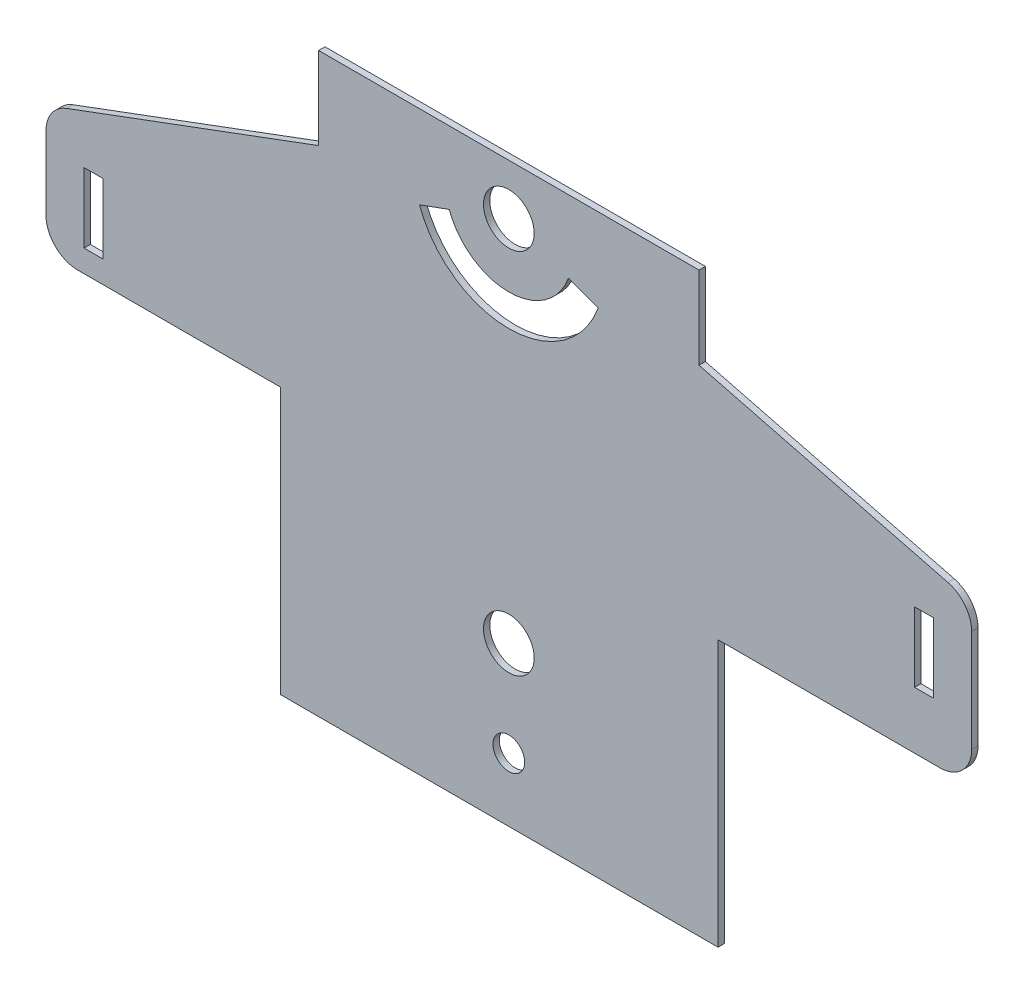
ISO-10303-21;
HEADER;
FILE_DESCRIPTION(('STEP AP214'),'2;1');
FILE_NAME('part.step','',(''),(''),'','','');
FILE_SCHEMA(('AUTOMOTIVE_DESIGN { 1 0 10303 214 1 1 1 1 }'));
ENDSEC;
DATA;
#1=APPLICATION_CONTEXT('core data for automotive mechanical design processes');
#2=APPLICATION_PROTOCOL_DEFINITION('international standard','automotive_design',2000,#1);
#3=PRODUCT_CONTEXT('',#1,'mechanical');
#4=PRODUCT('Part','Part','',(#3));
#5=PRODUCT_RELATED_PRODUCT_CATEGORY('part','',(#4));
#6=PRODUCT_DEFINITION_FORMATION('','',#4);
#7=PRODUCT_DEFINITION_CONTEXT('part definition',#1,'design');
#8=PRODUCT_DEFINITION('design','',#6,#7);
#9=PRODUCT_DEFINITION_SHAPE('','',#8);
#10=(LENGTH_UNIT() NAMED_UNIT(*) SI_UNIT(.MILLI.,.METRE.));
#11=(NAMED_UNIT(*) PLANE_ANGLE_UNIT() SI_UNIT($,.RADIAN.));
#12=(NAMED_UNIT(*) SI_UNIT($,.STERADIAN.) SOLID_ANGLE_UNIT());
#13=UNCERTAINTY_MEASURE_WITH_UNIT(LENGTH_MEASURE(1.E-05),#10,'distance_accuracy_value','');
#14=(GEOMETRIC_REPRESENTATION_CONTEXT(3) GLOBAL_UNCERTAINTY_ASSIGNED_CONTEXT((#13)) GLOBAL_UNIT_ASSIGNED_CONTEXT((#10,
#11,#12)) REPRESENTATION_CONTEXT('',''));
#15=CARTESIAN_POINT('',(0.,0.,0.));
#16=DIRECTION('',(0.,0.,1.));
#17=DIRECTION('',(1.,0.,0.));
#18=AXIS2_PLACEMENT_3D('',#15,#16,#17);
#19=CARTESIAN_POINT('',(0.,45.5,1.));
#20=DIRECTION('',(0.,-1.,0.));
#21=DIRECTION('',(1.,0.,0.));
#22=AXIS2_PLACEMENT_3D('',#19,#20,#21);
#23=PLANE('',#22);
#24=DIRECTION('',(0.,0.,1.));
#25=VECTOR('',#24,1.);
#26=CARTESIAN_POINT('',(-29.,45.5,1.));
#27=LINE('',#26,#25);
#28=CARTESIAN_POINT('',(-29.,45.5,0.));
#29=VERTEX_POINT('',#28);
#30=CARTESIAN_POINT('',(-29.,45.5,1.));
#31=VERTEX_POINT('',#30);
#32=EDGE_CURVE('E11',#29,#31,#27,.T.);
#33=ORIENTED_EDGE('',*,*,#32,.F.);
#34=DIRECTION('',(1.,0.,0.));
#35=VECTOR('',#34,1.);
#36=CARTESIAN_POINT('',(0.,45.5,0.));
#37=LINE('',#36,#35);
#38=CARTESIAN_POINT('',(-32.,45.5,0.));
#39=VERTEX_POINT('',#38);
#40=EDGE_CURVE('E165',#39,#29,#37,.T.);
#41=ORIENTED_EDGE('',*,*,#40,.F.);
#42=DIRECTION('',(0.,0.,1.));
#43=VECTOR('',#42,1.);
#44=CARTESIAN_POINT('',(-32.,45.5,1.));
#45=LINE('',#44,#43);
#46=CARTESIAN_POINT('',(-32.,45.5,1.));
#47=VERTEX_POINT('',#46);
#48=EDGE_CURVE('E48',#39,#47,#45,.T.);
#49=ORIENTED_EDGE('',*,*,#48,.T.);
#50=DIRECTION('',(1.,0.,0.));
#51=VECTOR('',#50,1.);
#52=CARTESIAN_POINT('',(0.,45.5,1.));
#53=LINE('',#52,#51);
#54=EDGE_CURVE('E255',#47,#31,#53,.T.);
#55=ORIENTED_EDGE('',*,*,#54,.T.);
#56=EDGE_LOOP('',(#33,#41,#49,#55));
#57=FACE_BOUND('',#56,.T.);
#58=ADVANCED_FACE('F38',(#57),#23,.F.);
#59=CARTESIAN_POINT('',(-32.,0.,1.));
#60=DIRECTION('',(-1.,0.,0.));
#61=DIRECTION('',(0.,-1.,0.));
#62=AXIS2_PLACEMENT_3D('',#59,#60,#61);
#63=PLANE('',#62);
#64=ORIENTED_EDGE('',*,*,#48,.F.);
#65=DIRECTION('',(0.,1.,0.));
#66=VECTOR('',#65,1.);
#67=CARTESIAN_POINT('',(-32.,0.,0.));
#68=LINE('',#67,#66);
#69=CARTESIAN_POINT('',(-32.,56.5,0.));
#70=VERTEX_POINT('',#69);
#71=EDGE_CURVE('E177',#70,#39,#68,.F.);
#72=ORIENTED_EDGE('',*,*,#71,.F.);
#73=DIRECTION('',(0.,0.,1.));
#74=VECTOR('',#73,1.);
#75=CARTESIAN_POINT('',(-32.,56.5,1.));
#76=LINE('',#75,#74);
#77=CARTESIAN_POINT('',(-32.,56.5,1.));
#78=VERTEX_POINT('',#77);
#79=EDGE_CURVE('E56',#70,#78,#76,.T.);
#80=ORIENTED_EDGE('',*,*,#79,.T.);
#81=DIRECTION('',(0.,-1.,0.));
#82=VECTOR('',#81,1.);
#83=CARTESIAN_POINT('',(-32.,0.,1.));
#84=LINE('',#83,#82);
#85=EDGE_CURVE('E230',#78,#47,#84,.T.);
#86=ORIENTED_EDGE('',*,*,#85,.T.);
#87=EDGE_LOOP('',(#64,#72,#80,#86));
#88=FACE_BOUND('',#87,.T.);
#89=ADVANCED_FACE('F260',(#88),#63,.F.);
#90=CARTESIAN_POINT('',(0.,56.5,1.));
#91=DIRECTION('',(0.,-1.,0.));
#92=DIRECTION('',(1.,0.,0.));
#93=AXIS2_PLACEMENT_3D('',#90,#91,#92);
#94=PLANE('',#93);
#95=ORIENTED_EDGE('',*,*,#79,.F.);
#96=DIRECTION('',(1.,0.,0.));
#97=VECTOR('',#96,1.);
#98=CARTESIAN_POINT('',(0.,56.5,0.));
#99=LINE('',#98,#97);
#100=CARTESIAN_POINT('',(-29.,56.5,0.));
#101=VERTEX_POINT('',#100);
#102=EDGE_CURVE('E164',#70,#101,#99,.T.);
#103=ORIENTED_EDGE('',*,*,#102,.T.);
#104=DIRECTION('',(0.,0.,1.));
#105=VECTOR('',#104,1.);
#106=CARTESIAN_POINT('',(-29.,56.5,1.));
#107=LINE('',#106,#105);
#108=CARTESIAN_POINT('',(-29.,56.5,1.));
#109=VERTEX_POINT('',#108);
#110=EDGE_CURVE('E42',#101,#109,#107,.T.);
#111=ORIENTED_EDGE('',*,*,#110,.T.);
#112=DIRECTION('',(1.,0.,0.));
#113=VECTOR('',#112,1.);
#114=CARTESIAN_POINT('',(0.,56.5,1.));
#115=LINE('',#114,#113);
#116=EDGE_CURVE('E491',#78,#109,#115,.T.);
#117=ORIENTED_EDGE('',*,*,#116,.F.);
#118=EDGE_LOOP('',(#95,#103,#111,#117));
#119=FACE_BOUND('',#118,.T.);
#120=ADVANCED_FACE('F167',(#119),#94,.T.);
#121=CARTESIAN_POINT('',(0.,62.,1.));
#122=DIRECTION('',(0.,1.,0.));
#123=DIRECTION('',(-1.,0.,0.));
#124=AXIS2_PLACEMENT_3D('',#121,#122,#123);
#125=PLANE('',#124);
#126=DIRECTION('',(0.,0.,1.));
#127=VECTOR('',#126,1.);
#128=CARTESIAN_POINT('',(99.,62.,1.));
#129=LINE('',#128,#127);
#130=CARTESIAN_POINT('',(99.,62.,0.));
#131=VERTEX_POINT('',#130);
#132=CARTESIAN_POINT('',(99.,62.,1.));
#133=VERTEX_POINT('',#132);
#134=EDGE_CURVE('E159',#131,#133,#129,.T.);
#135=ORIENTED_EDGE('',*,*,#134,.F.);
#136=DIRECTION('',(1.,0.,0.));
#137=VECTOR('',#136,1.);
#138=CARTESIAN_POINT('',(0.,62.,0.));
#139=LINE('',#138,#137);
#140=CARTESIAN_POINT('',(102.,62.,0.));
#141=VERTEX_POINT('',#140);
#142=EDGE_CURVE('E171',#141,#131,#139,.F.);
#143=ORIENTED_EDGE('',*,*,#142,.F.);
#144=DIRECTION('',(0.,0.,1.));
#145=VECTOR('',#144,1.);
#146=CARTESIAN_POINT('',(102.,62.,1.));
#147=LINE('',#146,#145);
#148=CARTESIAN_POINT('',(102.,62.,1.));
#149=VERTEX_POINT('',#148);
#150=EDGE_CURVE('E246',#141,#149,#147,.T.);
#151=ORIENTED_EDGE('',*,*,#150,.T.);
#152=DIRECTION('',(-1.,0.,0.));
#153=VECTOR('',#152,1.);
#154=CARTESIAN_POINT('',(0.,62.,1.));
#155=LINE('',#154,#153);
#156=EDGE_CURVE('E487',#149,#133,#155,.T.);
#157=ORIENTED_EDGE('',*,*,#156,.T.);
#158=EDGE_LOOP('',(#135,#143,#151,#157));
#159=FACE_BOUND('',#158,.T.);
#160=ADVANCED_FACE('F494',(#159),#125,.F.);
#161=CARTESIAN_POINT('',(102.,0.,1.));
#162=DIRECTION('',(1.,0.,0.));
#163=DIRECTION('',(0.,1.,0.));
#164=AXIS2_PLACEMENT_3D('',#161,#162,#163);
#165=PLANE('',#164);
#166=ORIENTED_EDGE('',*,*,#150,.F.);
#167=DIRECTION('',(0.,1.,0.));
#168=VECTOR('',#167,1.);
#169=CARTESIAN_POINT('',(102.,0.,0.));
#170=LINE('',#169,#168);
#171=CARTESIAN_POINT('',(102.,51.,0.));
#172=VERTEX_POINT('',#171);
#173=EDGE_CURVE('E168',#172,#141,#170,.T.);
#174=ORIENTED_EDGE('',*,*,#173,.F.);
#175=DIRECTION('',(0.,0.,1.));
#176=VECTOR('',#175,1.);
#177=CARTESIAN_POINT('',(102.,51.,1.));
#178=LINE('',#177,#176);
#179=CARTESIAN_POINT('',(102.,51.,1.));
#180=VERTEX_POINT('',#179);
#181=EDGE_CURVE('E243',#172,#180,#178,.T.);
#182=ORIENTED_EDGE('',*,*,#181,.T.);
#183=DIRECTION('',(0.,1.,0.));
#184=VECTOR('',#183,1.);
#185=CARTESIAN_POINT('',(102.,0.,1.));
#186=LINE('',#185,#184);
#187=EDGE_CURVE('E359',#180,#149,#186,.T.);
#188=ORIENTED_EDGE('',*,*,#187,.T.);
#189=EDGE_LOOP('',(#166,#174,#182,#188));
#190=FACE_BOUND('',#189,.T.);
#191=ADVANCED_FACE('F357',(#190),#165,.F.);
#192=CARTESIAN_POINT('',(0.,51.,1.));
#193=DIRECTION('',(0.,1.,0.));
#194=DIRECTION('',(-1.,0.,0.));
#195=AXIS2_PLACEMENT_3D('',#192,#193,#194);
#196=PLANE('',#195);
#197=ORIENTED_EDGE('',*,*,#181,.F.);
#198=DIRECTION('',(1.,0.,0.));
#199=VECTOR('',#198,1.);
#200=CARTESIAN_POINT('',(0.,51.,0.));
#201=LINE('',#200,#199);
#202=CARTESIAN_POINT('',(99.,51.,0.));
#203=VERTEX_POINT('',#202);
#204=EDGE_CURVE('E328',#172,#203,#201,.F.);
#205=ORIENTED_EDGE('',*,*,#204,.T.);
#206=DIRECTION('',(0.,0.,1.));
#207=VECTOR('',#206,1.);
#208=CARTESIAN_POINT('',(99.,51.,1.));
#209=LINE('',#208,#207);
#210=CARTESIAN_POINT('',(99.,51.,1.));
#211=VERTEX_POINT('',#210);
#212=EDGE_CURVE('E240',#203,#211,#209,.T.);
#213=ORIENTED_EDGE('',*,*,#212,.T.);
#214=DIRECTION('',(-1.,0.,0.));
#215=VECTOR('',#214,1.);
#216=CARTESIAN_POINT('',(0.,51.,1.));
#217=LINE('',#216,#215);
#218=EDGE_CURVE('E353',#180,#211,#217,.T.);
#219=ORIENTED_EDGE('',*,*,#218,.F.);
#220=EDGE_LOOP('',(#197,#205,#213,#219));
#221=FACE_BOUND('',#220,.T.);
#222=ADVANCED_FACE('F348',(#221),#196,.T.);
#223=CARTESIAN_POINT('',(30.7699080474094,84.539627558952,1.));
#224=DIRECTION('',(-0.34202014332567,-0.939692620785908,0.));
#225=DIRECTION('',(0.939692620785908,-0.34202014332567,0.));
#226=AXIS2_PLACEMENT_3D('',#223,#224,#225);
#227=PLANE('',#226);
#228=DIRECTION('',(0.,0.,1.));
#229=VECTOR('',#228,1.);
#230=CARTESIAN_POINT('',(44.3969262078591,79.5797985667433,1.));
#231=LINE('',#230,#229);
#232=CARTESIAN_POINT('',(44.3969262078591,79.5797985667433,0.));
#233=VERTEX_POINT('',#232);
#234=CARTESIAN_POINT('',(44.3969262078591,79.5797985667433,1.));
#235=VERTEX_POINT('',#234);
#236=EDGE_CURVE('E237',#233,#235,#231,.T.);
#237=ORIENTED_EDGE('',*,*,#236,.F.);
#238=DIRECTION('',(0.939692620785908,-0.34202014332567,0.));
#239=VECTOR('',#238,1.);
#240=CARTESIAN_POINT('',(30.7699080474094,84.539627558952,0.));
#241=LINE('',#240,#239);
#242=CARTESIAN_POINT('',(49.0953893117886,77.8696978501149,0.));
#243=VERTEX_POINT('',#242);
#244=EDGE_CURVE('E329',#233,#243,#241,.T.);
#245=ORIENTED_EDGE('',*,*,#244,.T.);
#246=DIRECTION('',(0.,0.,1.));
#247=VECTOR('',#246,1.);
#248=CARTESIAN_POINT('',(49.0953893117886,77.8696978501149,1.));
#249=LINE('',#248,#247);
#250=CARTESIAN_POINT('',(49.0953893117886,77.8696978501149,1.));
#251=VERTEX_POINT('',#250);
#252=EDGE_CURVE('E234',#243,#251,#249,.T.);
#253=ORIENTED_EDGE('',*,*,#252,.T.);
#254=DIRECTION('',(0.939692620785908,-0.34202014332567,0.));
#255=VECTOR('',#254,1.);
#256=CARTESIAN_POINT('',(30.7699080474094,84.539627558952,1.));
#257=LINE('',#256,#255);
#258=EDGE_CURVE('E478',#235,#251,#257,.T.);
#259=ORIENTED_EDGE('',*,*,#258,.F.);
#260=EDGE_LOOP('',(#237,#245,#253,#259));
#261=FACE_BOUND('',#260,.T.);
#262=ADVANCED_FACE('F521',(#261),#227,.T.);
#263=CARTESIAN_POINT('',(35.,83.,1.));
#264=DIRECTION('',(0.,0.,1.));
#265=DIRECTION('',(1.,0.,0.));
#266=AXIS2_PLACEMENT_3D('',#263,#264,#265);
#267=CYLINDRICAL_SURFACE('',#266,15.);
#268=ORIENTED_EDGE('',*,*,#252,.F.);
#269=CARTESIAN_POINT('',(35.,83.,0.));
#270=DIRECTION('',(0.,0.,1.));
#271=DIRECTION('',(1.,0.,0.));
#272=AXIS2_PLACEMENT_3D('',#269,#270,#271);
#273=CIRCLE('',#272,15.);
#274=CARTESIAN_POINT('',(20.9046106882113,77.869697850115,0.));
#275=VERTEX_POINT('',#274);
#276=EDGE_CURVE('E325',#275,#243,#273,.T.);
#277=ORIENTED_EDGE('',*,*,#276,.F.);
#278=DIRECTION('',(0.,0.,1.));
#279=VECTOR('',#278,1.);
#280=CARTESIAN_POINT('',(20.9046106882113,77.869697850115,1.));
#281=LINE('',#280,#279);
#282=CARTESIAN_POINT('',(20.9046106882113,77.869697850115,1.));
#283=VERTEX_POINT('',#282);
#284=EDGE_CURVE('E231',#275,#283,#281,.T.);
#285=ORIENTED_EDGE('',*,*,#284,.T.);
#286=CARTESIAN_POINT('',(35.,83.,1.));
#287=DIRECTION('',(0.,0.,1.));
#288=DIRECTION('',(1.,0.,0.));
#289=AXIS2_PLACEMENT_3D('',#286,#287,#288);
#290=CIRCLE('',#289,15.);
#291=EDGE_CURVE('E481',#283,#251,#290,.T.);
#292=ORIENTED_EDGE('',*,*,#291,.T.);
#293=EDGE_LOOP('',(#268,#277,#285,#292));
#294=FACE_BOUND('',#293,.T.);
#295=ADVANCED_FACE('F528',(#294),#267,.F.);
#296=CARTESIAN_POINT('',(-22.5814635565732,62.0420612199236,1.));
#297=DIRECTION('',(-0.342020143325663,0.939692620785911,0.));
#298=DIRECTION('',(-0.939692620785911,-0.342020143325663,0.));
#299=AXIS2_PLACEMENT_3D('',#296,#297,#298);
#300=PLANE('',#299);
#301=ORIENTED_EDGE('',*,*,#284,.F.);
#302=DIRECTION('',(-0.939692620785911,-0.342020143325663,0.));
#303=VECTOR('',#302,1.);
#304=CARTESIAN_POINT('',(-22.5814635565732,62.0420612199236,0.));
#305=LINE('',#304,#303);
#306=CARTESIAN_POINT('',(25.6030737921409,79.5797985667434,0.));
#307=VERTEX_POINT('',#306);
#308=EDGE_CURVE('E321',#307,#275,#305,.T.);
#309=ORIENTED_EDGE('',*,*,#308,.F.);
#310=DIRECTION('',(0.,0.,1.));
#311=VECTOR('',#310,1.);
#312=CARTESIAN_POINT('',(25.6030737921409,79.5797985667434,1.));
#313=LINE('',#312,#311);
#314=CARTESIAN_POINT('',(25.6030737921409,79.5797985667434,1.));
#315=VERTEX_POINT('',#314);
#316=EDGE_CURVE('E227',#307,#315,#313,.T.);
#317=ORIENTED_EDGE('',*,*,#316,.T.);
#318=DIRECTION('',(-0.939692620785911,-0.342020143325663,0.));
#319=VECTOR('',#318,1.);
#320=CARTESIAN_POINT('',(-22.5814635565732,62.0420612199236,1.));
#321=LINE('',#320,#319);
#322=EDGE_CURVE('E472',#315,#283,#321,.T.);
#323=ORIENTED_EDGE('',*,*,#322,.T.);
#324=EDGE_LOOP('',(#301,#309,#317,#323));
#325=FACE_BOUND('',#324,.T.);
#326=ADVANCED_FACE('F532',(#325),#300,.F.);
#327=CARTESIAN_POINT('',(22.7203045685279,88.8157360406091,1.));
#328=DIRECTION('',(0.247833249982633,0.968802704477566,0.));
#329=DIRECTION('',(-0.968802704477566,0.247833249982633,0.));
#330=AXIS2_PLACEMENT_3D('',#327,#328,#329);
#331=PLANE('',#330);
#332=DIRECTION('',(0.,0.,1.));
#333=VECTOR('',#332,1.);
#334=CARTESIAN_POINT('',(104.239166249913,67.9620737500222,1.));
#335=LINE('',#334,#333);
#336=CARTESIAN_POINT('',(104.239166249913,67.9620737500222,0.));
#337=VERTEX_POINT('',#336);
#338=CARTESIAN_POINT('',(104.239166249913,67.9620737500222,1.));
#339=VERTEX_POINT('',#338);
#340=EDGE_CURVE('E224',#337,#339,#335,.T.);
#341=ORIENTED_EDGE('',*,*,#340,.F.);
#342=DIRECTION('',(-0.968802704477566,0.247833249982633,0.));
#343=VECTOR('',#342,1.);
#344=CARTESIAN_POINT('',(22.7203045685279,88.8157360406091,0.));
#345=LINE('',#344,#343);
#346=CARTESIAN_POINT('',(65.,78.,0.));
#347=VERTEX_POINT('',#346);
#348=EDGE_CURVE('E308',#337,#347,#345,.T.);
#349=ORIENTED_EDGE('',*,*,#348,.T.);
#350=DIRECTION('',(0.,0.,1.));
#351=VECTOR('',#350,1.);
#352=CARTESIAN_POINT('',(65.,78.,1.));
#353=LINE('',#352,#351);
#354=CARTESIAN_POINT('',(65.,78.,1.));
#355=VERTEX_POINT('',#354);
#356=EDGE_CURVE('E221',#347,#355,#353,.T.);
#357=ORIENTED_EDGE('',*,*,#356,.T.);
#358=DIRECTION('',(-0.968802704477566,0.247833249982633,0.));
#359=VECTOR('',#358,1.);
#360=CARTESIAN_POINT('',(22.7203045685279,88.8157360406091,1.));
#361=LINE('',#360,#359);
#362=EDGE_CURVE('E424',#339,#355,#361,.T.);
#363=ORIENTED_EDGE('',*,*,#362,.F.);
#364=EDGE_LOOP('',(#341,#349,#357,#363));
#365=FACE_BOUND('',#364,.T.);
#366=ADVANCED_FACE('F536',(#365),#331,.T.);
#367=CARTESIAN_POINT('',(65.,0.,1.));
#368=DIRECTION('',(1.,0.,0.));
#369=DIRECTION('',(0.,1.,0.));
#370=AXIS2_PLACEMENT_3D('',#367,#368,#369);
#371=PLANE('',#370);
#372=ORIENTED_EDGE('',*,*,#356,.F.);
#373=DIRECTION('',(0.,1.,0.));
#374=VECTOR('',#373,1.);
#375=CARTESIAN_POINT('',(65.,0.,0.));
#376=LINE('',#375,#374);
#377=CARTESIAN_POINT('',(65.,91.,0.));
#378=VERTEX_POINT('',#377);
#379=EDGE_CURVE('E305',#347,#378,#376,.T.);
#380=ORIENTED_EDGE('',*,*,#379,.T.);
#381=DIRECTION('',(0.,0.,1.));
#382=VECTOR('',#381,1.);
#383=CARTESIAN_POINT('',(65.,91.,1.));
#384=LINE('',#383,#382);
#385=CARTESIAN_POINT('',(65.,91.,1.));
#386=VERTEX_POINT('',#385);
#387=EDGE_CURVE('E218',#378,#386,#384,.T.);
#388=ORIENTED_EDGE('',*,*,#387,.T.);
#389=DIRECTION('',(0.,1.,0.));
#390=VECTOR('',#389,1.);
#391=CARTESIAN_POINT('',(65.,0.,1.));
#392=LINE('',#391,#390);
#393=EDGE_CURVE('E426',#355,#386,#392,.T.);
#394=ORIENTED_EDGE('',*,*,#393,.F.);
#395=EDGE_LOOP('',(#372,#380,#388,#394));
#396=FACE_BOUND('',#395,.T.);
#397=ADVANCED_FACE('F553',(#396),#371,.T.);
#398=CARTESIAN_POINT('',(0.,91.,1.));
#399=DIRECTION('',(0.,1.,0.));
#400=DIRECTION('',(-1.,0.,0.));
#401=AXIS2_PLACEMENT_3D('',#398,#399,#400);
#402=PLANE('',#401);
#403=ORIENTED_EDGE('',*,*,#387,.F.);
#404=DIRECTION('',(1.,0.,0.));
#405=VECTOR('',#404,1.);
#406=CARTESIAN_POINT('',(0.,91.,0.));
#407=LINE('',#406,#405);
#408=CARTESIAN_POINT('',(5.,91.,0.));
#409=VERTEX_POINT('',#408);
#410=EDGE_CURVE('E302',#378,#409,#407,.F.);
#411=ORIENTED_EDGE('',*,*,#410,.T.);
#412=DIRECTION('',(0.,0.,1.));
#413=VECTOR('',#412,1.);
#414=CARTESIAN_POINT('',(5.,91.,1.));
#415=LINE('',#414,#413);
#416=CARTESIAN_POINT('',(5.,91.,1.));
#417=VERTEX_POINT('',#416);
#418=EDGE_CURVE('E215',#409,#417,#415,.T.);
#419=ORIENTED_EDGE('',*,*,#418,.T.);
#420=DIRECTION('',(-1.,0.,0.));
#421=VECTOR('',#420,1.);
#422=CARTESIAN_POINT('',(0.,91.,1.));
#423=LINE('',#422,#421);
#424=EDGE_CURVE('E431',#386,#417,#423,.T.);
#425=ORIENTED_EDGE('',*,*,#424,.F.);
#426=EDGE_LOOP('',(#403,#411,#419,#425));
#427=FACE_BOUND('',#426,.T.);
#428=ADVANCED_FACE('F557',(#427),#402,.T.);
#429=CARTESIAN_POINT('',(5.00000000000001,0.,1.));
#430=DIRECTION('',(-1.,0.,0.));
#431=DIRECTION('',(0.,-1.,0.));
#432=AXIS2_PLACEMENT_3D('',#429,#430,#431);
#433=PLANE('',#432);
#434=ORIENTED_EDGE('',*,*,#418,.F.);
#435=DIRECTION('',(0.,1.,0.));
#436=VECTOR('',#435,1.);
#437=CARTESIAN_POINT('',(5.,0.,0.));
#438=LINE('',#437,#436);
#439=CARTESIAN_POINT('',(5.00000000000001,78.,0.));
#440=VERTEX_POINT('',#439);
#441=EDGE_CURVE('E299',#409,#440,#438,.F.);
#442=ORIENTED_EDGE('',*,*,#441,.T.);
#443=DIRECTION('',(0.,0.,1.));
#444=VECTOR('',#443,1.);
#445=CARTESIAN_POINT('',(5.00000000000001,78.,1.));
#446=LINE('',#445,#444);
#447=CARTESIAN_POINT('',(5.00000000000001,78.,1.));
#448=VERTEX_POINT('',#447);
#449=EDGE_CURVE('E212',#440,#448,#446,.T.);
#450=ORIENTED_EDGE('',*,*,#449,.T.);
#451=DIRECTION('',(0.,-1.,0.));
#452=VECTOR('',#451,1.);
#453=CARTESIAN_POINT('',(5.00000000000001,0.,1.));
#454=LINE('',#453,#452);
#455=EDGE_CURVE('E434',#417,#448,#454,.T.);
#456=ORIENTED_EDGE('',*,*,#455,.F.);
#457=EDGE_LOOP('',(#434,#442,#450,#456));
#458=FACE_BOUND('',#457,.T.);
#459=ADVANCED_FACE('F561',(#458),#433,.T.);
#460=CARTESIAN_POINT('',(-24.8855106888361,66.879809976247,1.));
#461=DIRECTION('',(-0.348733712021418,0.937221851057562,0.));
#462=DIRECTION('',(-0.937221851057562,-0.348733712021418,0.));
#463=AXIS2_PLACEMENT_3D('',#460,#461,#462);
#464=PLANE('',#463);
#465=ORIENTED_EDGE('',*,*,#449,.F.);
#466=DIRECTION('',(-0.937221851057562,-0.348733712021418,0.));
#467=VECTOR('',#466,1.);
#468=CARTESIAN_POINT('',(-24.8855106888361,66.879809976247,0.));
#469=LINE('',#468,#467);
#470=CARTESIAN_POINT('',(-34.7436685601071,63.2116582101927,0.));
#471=VERTEX_POINT('',#470);
#472=EDGE_CURVE('E296',#440,#471,#469,.T.);
#473=ORIENTED_EDGE('',*,*,#472,.T.);
#474=DIRECTION('',(0.,0.,1.));
#475=VECTOR('',#474,1.);
#476=CARTESIAN_POINT('',(-34.7436685601071,63.2116582101927,1.));
#477=LINE('',#476,#475);
#478=CARTESIAN_POINT('',(-34.7436685601071,63.2116582101927,1.));
#479=VERTEX_POINT('',#478);
#480=EDGE_CURVE('E209',#471,#479,#477,.T.);
#481=ORIENTED_EDGE('',*,*,#480,.T.);
#482=DIRECTION('',(-0.937221851057562,-0.348733712021418,0.));
#483=VECTOR('',#482,1.);
#484=CARTESIAN_POINT('',(-24.8855106888361,66.879809976247,1.));
#485=LINE('',#484,#483);
#486=EDGE_CURVE('E437',#448,#479,#485,.T.);
#487=ORIENTED_EDGE('',*,*,#486,.F.);
#488=EDGE_LOOP('',(#465,#473,#481,#487));
#489=FACE_BOUND('',#488,.T.);
#490=ADVANCED_FACE('F565',(#489),#464,.T.);
#491=CARTESIAN_POINT('',(-33.,58.5255489549049,1.));
#492=DIRECTION('',(0.,0.,1.));
#493=DIRECTION('',(1.,0.,0.));
#494=AXIS2_PLACEMENT_3D('',#491,#492,#493);
#495=CYLINDRICAL_SURFACE('',#494,5.);
#496=ORIENTED_EDGE('',*,*,#480,.F.);
#497=CARTESIAN_POINT('',(-33.,58.5255489549049,0.));
#498=DIRECTION('',(0.,0.,1.));
#499=DIRECTION('',(1.,0.,0.));
#500=AXIS2_PLACEMENT_3D('',#497,#498,#499);
#501=CIRCLE('',#500,5.);
#502=CARTESIAN_POINT('',(-38.,58.5255489549049,0.));
#503=VERTEX_POINT('',#502);
#504=EDGE_CURVE('E293',#471,#503,#501,.T.);
#505=ORIENTED_EDGE('',*,*,#504,.T.);
#506=DIRECTION('',(0.,0.,1.));
#507=VECTOR('',#506,1.);
#508=CARTESIAN_POINT('',(-38.,58.5255489549049,1.));
#509=LINE('',#508,#507);
#510=CARTESIAN_POINT('',(-38.,58.5255489549049,1.));
#511=VERTEX_POINT('',#510);
#512=EDGE_CURVE('E206',#503,#511,#509,.T.);
#513=ORIENTED_EDGE('',*,*,#512,.T.);
#514=CARTESIAN_POINT('',(-33.,58.5255489549049,1.));
#515=DIRECTION('',(0.,0.,1.));
#516=DIRECTION('',(1.,0.,0.));
#517=AXIS2_PLACEMENT_3D('',#514,#515,#516);
#518=CIRCLE('',#517,5.);
#519=EDGE_CURVE('E440',#479,#511,#518,.T.);
#520=ORIENTED_EDGE('',*,*,#519,.F.);
#521=EDGE_LOOP('',(#496,#505,#513,#520));
#522=FACE_BOUND('',#521,.T.);
#523=ADVANCED_FACE('F569',(#522),#495,.T.);
#524=CARTESIAN_POINT('',(-38.,0.,1.));
#525=DIRECTION('',(-1.,0.,0.));
#526=DIRECTION('',(0.,-1.,0.));
#527=AXIS2_PLACEMENT_3D('',#524,#525,#526);
#528=PLANE('',#527);
#529=ORIENTED_EDGE('',*,*,#512,.F.);
#530=DIRECTION('',(0.,1.,0.));
#531=VECTOR('',#530,1.);
#532=CARTESIAN_POINT('',(-38.,0.,0.));
#533=LINE('',#532,#531);
#534=CARTESIAN_POINT('',(-38.,47.,0.));
#535=VERTEX_POINT('',#534);
#536=EDGE_CURVE('E290',#503,#535,#533,.F.);
#537=ORIENTED_EDGE('',*,*,#536,.T.);
#538=DIRECTION('',(0.,0.,1.));
#539=VECTOR('',#538,1.);
#540=CARTESIAN_POINT('',(-38.,47.,1.));
#541=LINE('',#540,#539);
#542=CARTESIAN_POINT('',(-38.,47.,1.));
#543=VERTEX_POINT('',#542);
#544=EDGE_CURVE('E203',#535,#543,#541,.T.);
#545=ORIENTED_EDGE('',*,*,#544,.T.);
#546=DIRECTION('',(0.,-1.,0.));
#547=VECTOR('',#546,1.);
#548=CARTESIAN_POINT('',(-38.,0.,1.));
#549=LINE('',#548,#547);
#550=EDGE_CURVE('E443',#511,#543,#549,.T.);
#551=ORIENTED_EDGE('',*,*,#550,.F.);
#552=EDGE_LOOP('',(#529,#537,#545,#551));
#553=FACE_BOUND('',#552,.T.);
#554=ADVANCED_FACE('F573',(#553),#528,.T.);
#555=CARTESIAN_POINT('',(-33.,47.,1.));
#556=DIRECTION('',(0.,0.,1.));
#557=DIRECTION('',(1.,0.,0.));
#558=AXIS2_PLACEMENT_3D('',#555,#556,#557);
#559=CYLINDRICAL_SURFACE('',#558,5.);
#560=ORIENTED_EDGE('',*,*,#544,.F.);
#561=CARTESIAN_POINT('',(-33.,47.,0.));
#562=DIRECTION('',(0.,0.,1.));
#563=DIRECTION('',(1.,0.,0.));
#564=AXIS2_PLACEMENT_3D('',#561,#562,#563);
#565=CIRCLE('',#564,5.);
#566=CARTESIAN_POINT('',(-33.,42.,0.));
#567=VERTEX_POINT('',#566);
#568=EDGE_CURVE('E287',#535,#567,#565,.T.);
#569=ORIENTED_EDGE('',*,*,#568,.T.);
#570=DIRECTION('',(0.,0.,1.));
#571=VECTOR('',#570,1.);
#572=CARTESIAN_POINT('',(-33.,42.,1.));
#573=LINE('',#572,#571);
#574=CARTESIAN_POINT('',(-33.,42.,1.));
#575=VERTEX_POINT('',#574);
#576=EDGE_CURVE('E200',#567,#575,#573,.T.);
#577=ORIENTED_EDGE('',*,*,#576,.T.);
#578=CARTESIAN_POINT('',(-33.,47.,1.));
#579=DIRECTION('',(0.,0.,1.));
#580=DIRECTION('',(1.,0.,0.));
#581=AXIS2_PLACEMENT_3D('',#578,#579,#580);
#582=CIRCLE('',#581,5.);
#583=EDGE_CURVE('E446',#543,#575,#582,.T.);
#584=ORIENTED_EDGE('',*,*,#583,.F.);
#585=EDGE_LOOP('',(#560,#569,#577,#584));
#586=FACE_BOUND('',#585,.T.);
#587=ADVANCED_FACE('F577',(#586),#559,.T.);
#588=CARTESIAN_POINT('',(0.,42.,1.));
#589=DIRECTION('',(0.,-1.,0.));
#590=DIRECTION('',(1.,0.,0.));
#591=AXIS2_PLACEMENT_3D('',#588,#589,#590);
#592=PLANE('',#591);
#593=ORIENTED_EDGE('',*,*,#576,.F.);
#594=DIRECTION('',(1.,0.,0.));
#595=VECTOR('',#594,1.);
#596=CARTESIAN_POINT('',(0.,42.,0.));
#597=LINE('',#596,#595);
#598=CARTESIAN_POINT('',(-1.,42.,0.));
#599=VERTEX_POINT('',#598);
#600=EDGE_CURVE('E284',#567,#599,#597,.T.);
#601=ORIENTED_EDGE('',*,*,#600,.T.);
#602=DIRECTION('',(0.,0.,1.));
#603=VECTOR('',#602,1.);
#604=CARTESIAN_POINT('',(-1.,42.,1.));
#605=LINE('',#604,#603);
#606=CARTESIAN_POINT('',(-1.,42.,1.));
#607=VERTEX_POINT('',#606);
#608=EDGE_CURVE('E197',#599,#607,#605,.T.);
#609=ORIENTED_EDGE('',*,*,#608,.T.);
#610=DIRECTION('',(1.,0.,0.));
#611=VECTOR('',#610,1.);
#612=CARTESIAN_POINT('',(0.,42.,1.));
#613=LINE('',#612,#611);
#614=EDGE_CURVE('E449',#575,#607,#613,.T.);
#615=ORIENTED_EDGE('',*,*,#614,.F.);
#616=EDGE_LOOP('',(#593,#601,#609,#615));
#617=FACE_BOUND('',#616,.T.);
#618=ADVANCED_FACE('F581',(#617),#592,.T.);
#619=CARTESIAN_POINT('',(-1.,42.,1.));
#620=DIRECTION('',(-1.,0.,0.));
#621=DIRECTION('',(0.,-1.,0.));
#622=AXIS2_PLACEMENT_3D('',#619,#620,#621);
#623=PLANE('',#622);
#624=ORIENTED_EDGE('',*,*,#608,.F.);
#625=DIRECTION('',(0.,1.,0.));
#626=VECTOR('',#625,1.);
#627=CARTESIAN_POINT('',(-1.,0.,0.));
#628=LINE('',#627,#626);
#629=CARTESIAN_POINT('',(-1.,0.,0.));
#630=VERTEX_POINT('',#629);
#631=EDGE_CURVE('E281',#599,#630,#628,.F.);
#632=ORIENTED_EDGE('',*,*,#631,.T.);
#633=DIRECTION('',(0.,0.,1.));
#634=VECTOR('',#633,1.);
#635=CARTESIAN_POINT('',(-1.,0.,1.));
#636=LINE('',#635,#634);
#637=CARTESIAN_POINT('',(-1.,0.,1.));
#638=VERTEX_POINT('',#637);
#639=EDGE_CURVE('E194',#630,#638,#636,.T.);
#640=ORIENTED_EDGE('',*,*,#639,.T.);
#641=DIRECTION('',(0.,-1.,0.));
#642=VECTOR('',#641,1.);
#643=CARTESIAN_POINT('',(-1.,42.,1.));
#644=LINE('',#643,#642);
#645=EDGE_CURVE('E452',#607,#638,#644,.T.);
#646=ORIENTED_EDGE('',*,*,#645,.F.);
#647=EDGE_LOOP('',(#624,#632,#640,#646));
#648=FACE_BOUND('',#647,.T.);
#649=ADVANCED_FACE('F583',(#648),#623,.T.);
#650=CARTESIAN_POINT('',(0.,0.,1.));
#651=DIRECTION('',(0.,-1.,0.));
#652=DIRECTION('',(1.,0.,0.));
#653=AXIS2_PLACEMENT_3D('',#650,#651,#652);
#654=PLANE('',#653);
#655=ORIENTED_EDGE('',*,*,#639,.F.);
#656=DIRECTION('',(1.,0.,0.));
#657=VECTOR('',#656,1.);
#658=CARTESIAN_POINT('',(0.,0.,0.));
#659=LINE('',#658,#657);
#660=CARTESIAN_POINT('',(68.,0.,0.));
#661=VERTEX_POINT('',#660);
#662=EDGE_CURVE('E278',#630,#661,#659,.T.);
#663=ORIENTED_EDGE('',*,*,#662,.T.);
#664=DIRECTION('',(0.,0.,1.));
#665=VECTOR('',#664,1.);
#666=CARTESIAN_POINT('',(68.,0.,1.));
#667=LINE('',#666,#665);
#668=CARTESIAN_POINT('',(68.,0.,1.));
#669=VERTEX_POINT('',#668);
#670=EDGE_CURVE('E191',#661,#669,#667,.T.);
#671=ORIENTED_EDGE('',*,*,#670,.T.);
#672=DIRECTION('',(1.,0.,0.));
#673=VECTOR('',#672,1.);
#674=CARTESIAN_POINT('',(0.,0.,1.));
#675=LINE('',#674,#673);
#676=EDGE_CURVE('E456',#638,#669,#675,.T.);
#677=ORIENTED_EDGE('',*,*,#676,.F.);
#678=EDGE_LOOP('',(#655,#663,#671,#677));
#679=FACE_BOUND('',#678,.T.);
#680=ADVANCED_FACE('F586',(#679),#654,.T.);
#681=CARTESIAN_POINT('',(68.,0.,1.));
#682=DIRECTION('',(1.,0.,0.));
#683=DIRECTION('',(0.,1.,0.));
#684=AXIS2_PLACEMENT_3D('',#681,#682,#683);
#685=PLANE('',#684);
#686=ORIENTED_EDGE('',*,*,#670,.F.);
#687=DIRECTION('',(0.,1.,0.));
#688=VECTOR('',#687,1.);
#689=CARTESIAN_POINT('',(68.,0.,0.));
#690=LINE('',#689,#688);
#691=CARTESIAN_POINT('',(68.,42.,0.));
#692=VERTEX_POINT('',#691);
#693=EDGE_CURVE('E275',#661,#692,#690,.T.);
#694=ORIENTED_EDGE('',*,*,#693,.T.);
#695=DIRECTION('',(0.,0.,1.));
#696=VECTOR('',#695,1.);
#697=CARTESIAN_POINT('',(68.,42.,1.));
#698=LINE('',#697,#696);
#699=CARTESIAN_POINT('',(68.,42.,1.));
#700=VERTEX_POINT('',#699);
#701=EDGE_CURVE('E188',#692,#700,#698,.T.);
#702=ORIENTED_EDGE('',*,*,#701,.T.);
#703=DIRECTION('',(0.,1.,0.));
#704=VECTOR('',#703,1.);
#705=CARTESIAN_POINT('',(68.,0.,1.));
#706=LINE('',#705,#704);
#707=EDGE_CURVE('E459',#669,#700,#706,.T.);
#708=ORIENTED_EDGE('',*,*,#707,.F.);
#709=EDGE_LOOP('',(#686,#694,#702,#708));
#710=FACE_BOUND('',#709,.T.);
#711=ADVANCED_FACE('F590',(#710),#685,.T.);
#712=ORIENTED_EDGE('',*,*,#701,.F.);
#713=DIRECTION('',(1.,0.,0.));
#714=VECTOR('',#713,1.);
#715=CARTESIAN_POINT('',(0.,42.,0.));
#716=LINE('',#715,#714);
#717=CARTESIAN_POINT('',(103.,42.,0.));
#718=VERTEX_POINT('',#717);
#719=EDGE_CURVE('E272',#692,#718,#716,.T.);
#720=ORIENTED_EDGE('',*,*,#719,.T.);
#721=DIRECTION('',(0.,0.,1.));
#722=VECTOR('',#721,1.);
#723=CARTESIAN_POINT('',(103.,42.,1.));
#724=LINE('',#723,#722);
#725=CARTESIAN_POINT('',(103.,42.,1.));
#726=VERTEX_POINT('',#725);
#727=EDGE_CURVE('E184',#718,#726,#724,.T.);
#728=ORIENTED_EDGE('',*,*,#727,.T.);
#729=EDGE_CURVE('E453',#700,#726,#613,.T.);
#730=ORIENTED_EDGE('',*,*,#729,.F.);
#731=EDGE_LOOP('',(#712,#720,#728,#730));
#732=FACE_BOUND('',#731,.T.);
#733=ADVANCED_FACE('F594',(#732),#592,.T.);
#734=CARTESIAN_POINT('',(103.,47.,1.));
#735=DIRECTION('',(0.,0.,1.));
#736=DIRECTION('',(1.,0.,0.));
#737=AXIS2_PLACEMENT_3D('',#734,#735,#736);
#738=CYLINDRICAL_SURFACE('',#737,5.);
#739=ORIENTED_EDGE('',*,*,#727,.F.);
#740=CARTESIAN_POINT('',(103.,47.,0.));
#741=DIRECTION('',(0.,0.,1.));
#742=DIRECTION('',(1.,0.,0.));
#743=AXIS2_PLACEMENT_3D('',#740,#741,#742);
#744=CIRCLE('',#743,5.);
#745=CARTESIAN_POINT('',(108.,47.,0.));
#746=VERTEX_POINT('',#745);
#747=EDGE_CURVE('E268',#718,#746,#744,.T.);
#748=ORIENTED_EDGE('',*,*,#747,.T.);
#749=DIRECTION('',(0.,0.,1.));
#750=VECTOR('',#749,1.);
#751=CARTESIAN_POINT('',(108.,47.,1.));
#752=LINE('',#751,#750);
#753=CARTESIAN_POINT('',(108.,47.,1.));
#754=VERTEX_POINT('',#753);
#755=EDGE_CURVE('E181',#746,#754,#752,.T.);
#756=ORIENTED_EDGE('',*,*,#755,.T.);
#757=CARTESIAN_POINT('',(103.,47.,1.));
#758=DIRECTION('',(0.,0.,1.));
#759=DIRECTION('',(1.,0.,0.));
#760=AXIS2_PLACEMENT_3D('',#757,#758,#759);
#761=CIRCLE('',#760,5.);
#762=EDGE_CURVE('E421',#726,#754,#761,.T.);
#763=ORIENTED_EDGE('',*,*,#762,.F.);
#764=EDGE_LOOP('',(#739,#748,#756,#763));
#765=FACE_BOUND('',#764,.T.);
#766=ADVANCED_FACE('F598',(#765),#738,.T.);
#767=CARTESIAN_POINT('',(108.,0.,1.));
#768=DIRECTION('',(1.,0.,0.));
#769=DIRECTION('',(0.,1.,0.));
#770=AXIS2_PLACEMENT_3D('',#767,#768,#769);
#771=PLANE('',#770);
#772=ORIENTED_EDGE('',*,*,#755,.F.);
#773=DIRECTION('',(0.,1.,0.));
#774=VECTOR('',#773,1.);
#775=CARTESIAN_POINT('',(108.,0.,0.));
#776=LINE('',#775,#774);
#777=CARTESIAN_POINT('',(108.,63.1180602276344,0.));
#778=VERTEX_POINT('',#777);
#779=EDGE_CURVE('E264',#746,#778,#776,.T.);
#780=ORIENTED_EDGE('',*,*,#779,.T.);
#781=DIRECTION('',(0.,0.,1.));
#782=VECTOR('',#781,1.);
#783=CARTESIAN_POINT('',(108.,63.1180602276344,1.));
#784=LINE('',#783,#782);
#785=CARTESIAN_POINT('',(108.,63.1180602276344,1.));
#786=VERTEX_POINT('',#785);
#787=EDGE_CURVE('E185',#778,#786,#784,.T.);
#788=ORIENTED_EDGE('',*,*,#787,.T.);
#789=DIRECTION('',(0.,1.,0.));
#790=VECTOR('',#789,1.);
#791=CARTESIAN_POINT('',(108.,0.,1.));
#792=LINE('',#791,#790);
#793=EDGE_CURVE('E179',#754,#786,#792,.T.);
#794=ORIENTED_EDGE('',*,*,#793,.F.);
#795=EDGE_LOOP('',(#772,#780,#788,#794));
#796=FACE_BOUND('',#795,.T.);
#797=ADVANCED_FACE('F407',(#796),#771,.T.);
#798=CARTESIAN_POINT('',(103.,63.1180602276344,1.));
#799=DIRECTION('',(0.,0.,1.));
#800=DIRECTION('',(1.,0.,0.));
#801=AXIS2_PLACEMENT_3D('',#798,#799,#800);
#802=CYLINDRICAL_SURFACE('',#801,5.);
#803=CARTESIAN_POINT('',(103.,63.1180602276344,0.));
#804=DIRECTION('',(0.,0.,1.));
#805=DIRECTION('',(1.,0.,0.));
#806=AXIS2_PLACEMENT_3D('',#803,#804,#805);
#807=CIRCLE('',#806,5.);
#808=EDGE_CURVE('E267',#778,#337,#807,.T.);
#809=ORIENTED_EDGE('',*,*,#808,.T.);
#810=ORIENTED_EDGE('',*,*,#340,.T.);
#811=CARTESIAN_POINT('',(103.,63.1180602276344,1.));
#812=DIRECTION('',(0.,0.,1.));
#813=DIRECTION('',(1.,0.,0.));
#814=AXIS2_PLACEMENT_3D('',#811,#812,#813);
#815=CIRCLE('',#814,5.);
#816=EDGE_CURVE('E417',#786,#339,#815,.T.);
#817=ORIENTED_EDGE('',*,*,#816,.F.);
#818=ORIENTED_EDGE('',*,*,#787,.F.);
#819=EDGE_LOOP('',(#809,#810,#817,#818));
#820=FACE_BOUND('',#819,.T.);
#821=ADVANCED_FACE('F423',(#820),#802,.T.);
#822=CARTESIAN_POINT('',(35.,10.,1.));
#823=DIRECTION('',(0.,0.,1.));
#824=DIRECTION('',(1.,0.,0.));
#825=AXIS2_PLACEMENT_3D('',#822,#823,#824);
#826=CYLINDRICAL_SURFACE('',#825,2.5);
#827=CARTESIAN_POINT('',(35.,10.,1.));
#828=DIRECTION('',(0.,0.,1.));
#829=DIRECTION('',(1.,0.,0.));
#830=AXIS2_PLACEMENT_3D('',#827,#828,#829);
#831=CIRCLE('',#830,2.5);
#832=CARTESIAN_POINT('',(37.5,10.,1.));
#833=VERTEX_POINT('',#832);
#834=EDGE_CURVE('E463',#833,#833,#831,.T.);
#835=ORIENTED_EDGE('',*,*,#834,.T.);
#836=EDGE_LOOP('',(#835));
#837=FACE_BOUND('',#836,.T.);
#838=CARTESIAN_POINT('',(35.,10.,0.));
#839=DIRECTION('',(0.,0.,1.));
#840=DIRECTION('',(1.,0.,0.));
#841=AXIS2_PLACEMENT_3D('',#838,#839,#840);
#842=CIRCLE('',#841,2.5);
#843=CARTESIAN_POINT('',(37.5,10.,0.));
#844=VERTEX_POINT('',#843);
#845=EDGE_CURVE('E271',#844,#844,#842,.T.);
#846=ORIENTED_EDGE('',*,*,#845,.F.);
#847=EDGE_LOOP('',(#846));
#848=FACE_BOUND('',#847,.T.);
#849=ADVANCED_FACE('F544',(#837,#848),#826,.F.);
#850=CARTESIAN_POINT('',(35.,25.,1.));
#851=DIRECTION('',(0.,0.,1.));
#852=DIRECTION('',(1.,0.,0.));
#853=AXIS2_PLACEMENT_3D('',#850,#851,#852);
#854=CYLINDRICAL_SURFACE('',#853,4.);
#855=CARTESIAN_POINT('',(35.,25.,1.));
#856=DIRECTION('',(0.,0.,1.));
#857=DIRECTION('',(1.,0.,0.));
#858=AXIS2_PLACEMENT_3D('',#855,#856,#857);
#859=CIRCLE('',#858,4.);
#860=CARTESIAN_POINT('',(39.,25.,1.));
#861=VERTEX_POINT('',#860);
#862=EDGE_CURVE('E466',#861,#861,#859,.T.);
#863=ORIENTED_EDGE('',*,*,#862,.T.);
#864=EDGE_LOOP('',(#863));
#865=FACE_BOUND('',#864,.T.);
#866=CARTESIAN_POINT('',(35.,25.,0.));
#867=DIRECTION('',(0.,0.,1.));
#868=DIRECTION('',(1.,0.,0.));
#869=AXIS2_PLACEMENT_3D('',#866,#867,#868);
#870=CIRCLE('',#869,4.);
#871=CARTESIAN_POINT('',(39.,25.,0.));
#872=VERTEX_POINT('',#871);
#873=EDGE_CURVE('E315',#872,#872,#870,.T.);
#874=ORIENTED_EDGE('',*,*,#873,.F.);
#875=EDGE_LOOP('',(#874));
#876=FACE_BOUND('',#875,.T.);
#877=ADVANCED_FACE('F540',(#865,#876),#854,.F.);
#878=CARTESIAN_POINT('',(35.,83.,1.));
#879=DIRECTION('',(0.,0.,1.));
#880=DIRECTION('',(1.,0.,0.));
#881=AXIS2_PLACEMENT_3D('',#878,#879,#880);
#882=CYLINDRICAL_SURFACE('',#881,4.00000000000001);
#883=CARTESIAN_POINT('',(35.,83.,1.));
#884=DIRECTION('',(0.,0.,1.));
#885=DIRECTION('',(1.,0.,0.));
#886=AXIS2_PLACEMENT_3D('',#883,#884,#885);
#887=CIRCLE('',#886,4.00000000000001);
#888=CARTESIAN_POINT('',(39.,83.,1.));
#889=VERTEX_POINT('',#888);
#890=EDGE_CURVE('E469',#889,#889,#887,.T.);
#891=ORIENTED_EDGE('',*,*,#890,.T.);
#892=EDGE_LOOP('',(#891));
#893=FACE_BOUND('',#892,.T.);
#894=CARTESIAN_POINT('',(35.,83.,0.));
#895=DIRECTION('',(0.,0.,1.));
#896=DIRECTION('',(1.,0.,0.));
#897=AXIS2_PLACEMENT_3D('',#894,#895,#896);
#898=CIRCLE('',#897,4.00000000000001);
#899=CARTESIAN_POINT('',(39.,83.,0.));
#900=VERTEX_POINT('',#899);
#901=EDGE_CURVE('E318',#900,#900,#898,.T.);
#902=ORIENTED_EDGE('',*,*,#901,.F.);
#903=EDGE_LOOP('',(#902));
#904=FACE_BOUND('',#903,.T.);
#905=ADVANCED_FACE('F524',(#893,#904),#882,.F.);
#906=CARTESIAN_POINT('',(35.,83.,1.));
#907=DIRECTION('',(0.,0.,1.));
#908=DIRECTION('',(1.,0.,0.));
#909=AXIS2_PLACEMENT_3D('',#906,#907,#908);
#910=CYLINDRICAL_SURFACE('',#909,10.);
#911=CARTESIAN_POINT('',(35.,83.,0.));
#912=DIRECTION('',(0.,0.,1.));
#913=DIRECTION('',(1.,0.,0.));
#914=AXIS2_PLACEMENT_3D('',#911,#912,#913);
#915=CIRCLE('',#914,10.);
#916=EDGE_CURVE('E324',#307,#233,#915,.T.);
#917=ORIENTED_EDGE('',*,*,#916,.T.);
#918=ORIENTED_EDGE('',*,*,#236,.T.);
#919=CARTESIAN_POINT('',(35.,83.,1.));
#920=DIRECTION('',(0.,0.,1.));
#921=DIRECTION('',(1.,0.,0.));
#922=AXIS2_PLACEMENT_3D('',#919,#920,#921);
#923=CIRCLE('',#922,10.);
#924=EDGE_CURVE('E475',#315,#235,#923,.T.);
#925=ORIENTED_EDGE('',*,*,#924,.F.);
#926=ORIENTED_EDGE('',*,*,#316,.F.);
#927=EDGE_LOOP('',(#917,#918,#925,#926));
#928=FACE_BOUND('',#927,.T.);
#929=ADVANCED_FACE('F514',(#928),#910,.T.);
#930=CARTESIAN_POINT('',(99.,0.,1.));
#931=DIRECTION('',(1.,0.,0.));
#932=DIRECTION('',(0.,1.,0.));
#933=AXIS2_PLACEMENT_3D('',#930,#931,#932);
#934=PLANE('',#933);
#935=DIRECTION('',(0.,1.,0.));
#936=VECTOR('',#935,1.);
#937=CARTESIAN_POINT('',(99.,0.,0.));
#938=LINE('',#937,#936);
#939=EDGE_CURVE('E175',#203,#131,#938,.T.);
#940=ORIENTED_EDGE('',*,*,#939,.T.);
#941=ORIENTED_EDGE('',*,*,#134,.T.);
#942=DIRECTION('',(0.,1.,0.));
#943=VECTOR('',#942,1.);
#944=CARTESIAN_POINT('',(99.,0.,1.));
#945=LINE('',#944,#943);
#946=EDGE_CURVE('E485',#211,#133,#945,.T.);
#947=ORIENTED_EDGE('',*,*,#946,.F.);
#948=ORIENTED_EDGE('',*,*,#212,.F.);
#949=EDGE_LOOP('',(#940,#941,#947,#948));
#950=FACE_BOUND('',#949,.T.);
#951=ADVANCED_FACE('F341',(#950),#934,.T.);
#952=CARTESIAN_POINT('',(-29.,0.,1.));
#953=DIRECTION('',(-1.,0.,0.));
#954=DIRECTION('',(0.,-1.,0.));
#955=AXIS2_PLACEMENT_3D('',#952,#953,#954);
#956=PLANE('',#955);
#957=DIRECTION('',(0.,1.,0.));
#958=VECTOR('',#957,1.);
#959=CARTESIAN_POINT('',(-29.,0.,0.));
#960=LINE('',#959,#958);
#961=EDGE_CURVE('E152',#101,#29,#960,.F.);
#962=ORIENTED_EDGE('',*,*,#961,.T.);
#963=ORIENTED_EDGE('',*,*,#32,.T.);
#964=DIRECTION('',(0.,-1.,0.));
#965=VECTOR('',#964,1.);
#966=CARTESIAN_POINT('',(-29.,0.,1.));
#967=LINE('',#966,#965);
#968=EDGE_CURVE('E155',#109,#31,#967,.T.);
#969=ORIENTED_EDGE('',*,*,#968,.F.);
#970=ORIENTED_EDGE('',*,*,#110,.F.);
#971=EDGE_LOOP('',(#962,#963,#969,#970));
#972=FACE_BOUND('',#971,.T.);
#973=ADVANCED_FACE('F40',(#972),#956,.T.);
#974=CARTESIAN_POINT('',(0.,0.,1.));
#975=DIRECTION('',(0.,0.,1.));
#976=DIRECTION('',(1.,0.,0.));
#977=AXIS2_PLACEMENT_3D('',#974,#975,#976);
#978=PLANE('',#977);
#979=ORIENTED_EDGE('',*,*,#793,.T.);
#980=ORIENTED_EDGE('',*,*,#816,.T.);
#981=ORIENTED_EDGE('',*,*,#362,.T.);
#982=ORIENTED_EDGE('',*,*,#393,.T.);
#983=ORIENTED_EDGE('',*,*,#424,.T.);
#984=ORIENTED_EDGE('',*,*,#455,.T.);
#985=ORIENTED_EDGE('',*,*,#486,.T.);
#986=ORIENTED_EDGE('',*,*,#519,.T.);
#987=ORIENTED_EDGE('',*,*,#550,.T.);
#988=ORIENTED_EDGE('',*,*,#583,.T.);
#989=ORIENTED_EDGE('',*,*,#614,.T.);
#990=ORIENTED_EDGE('',*,*,#645,.T.);
#991=ORIENTED_EDGE('',*,*,#676,.T.);
#992=ORIENTED_EDGE('',*,*,#707,.T.);
#993=ORIENTED_EDGE('',*,*,#729,.T.);
#994=ORIENTED_EDGE('',*,*,#762,.T.);
#995=EDGE_LOOP('',(#979,#980,#981,#982,#983,#984,#985,#986,#987,#988,#989,#990,#991,#992,#993,#994));
#996=FACE_BOUND('',#995,.T.);
#997=ORIENTED_EDGE('',*,*,#834,.F.);
#998=EDGE_LOOP('',(#997));
#999=FACE_BOUND('',#998,.T.);
#1000=ORIENTED_EDGE('',*,*,#862,.F.);
#1001=EDGE_LOOP('',(#1000));
#1002=FACE_BOUND('',#1001,.T.);
#1003=ORIENTED_EDGE('',*,*,#890,.F.);
#1004=EDGE_LOOP('',(#1003));
#1005=FACE_BOUND('',#1004,.T.);
#1006=ORIENTED_EDGE('',*,*,#322,.F.);
#1007=ORIENTED_EDGE('',*,*,#924,.T.);
#1008=ORIENTED_EDGE('',*,*,#258,.T.);
#1009=ORIENTED_EDGE('',*,*,#291,.F.);
#1010=EDGE_LOOP('',(#1006,#1007,#1008,#1009));
#1011=FACE_BOUND('',#1010,.T.);
#1012=ORIENTED_EDGE('',*,*,#218,.T.);
#1013=ORIENTED_EDGE('',*,*,#946,.T.);
#1014=ORIENTED_EDGE('',*,*,#156,.F.);
#1015=ORIENTED_EDGE('',*,*,#187,.F.);
#1016=EDGE_LOOP('',(#1012,#1013,#1014,#1015));
#1017=FACE_BOUND('',#1016,.T.);
#1018=ORIENTED_EDGE('',*,*,#116,.T.);
#1019=ORIENTED_EDGE('',*,*,#968,.T.);
#1020=ORIENTED_EDGE('',*,*,#54,.F.);
#1021=ORIENTED_EDGE('',*,*,#85,.F.);
#1022=EDGE_LOOP('',(#1018,#1019,#1020,#1021));
#1023=FACE_BOUND('',#1022,.T.);
#1024=ADVANCED_FACE('F258',(#996,#999,#1002,#1005,#1011,#1017,#1023),#978,.T.);
#1025=CARTESIAN_POINT('',(0.,0.,0.));
#1026=DIRECTION('',(0.,0.,1.));
#1027=DIRECTION('',(1.,0.,0.));
#1028=AXIS2_PLACEMENT_3D('',#1025,#1026,#1027);
#1029=PLANE('',#1028);
#1030=ORIENTED_EDGE('',*,*,#779,.F.);
#1031=ORIENTED_EDGE('',*,*,#747,.F.);
#1032=ORIENTED_EDGE('',*,*,#719,.F.);
#1033=ORIENTED_EDGE('',*,*,#693,.F.);
#1034=ORIENTED_EDGE('',*,*,#662,.F.);
#1035=ORIENTED_EDGE('',*,*,#631,.F.);
#1036=ORIENTED_EDGE('',*,*,#600,.F.);
#1037=ORIENTED_EDGE('',*,*,#568,.F.);
#1038=ORIENTED_EDGE('',*,*,#536,.F.);
#1039=ORIENTED_EDGE('',*,*,#504,.F.);
#1040=ORIENTED_EDGE('',*,*,#472,.F.);
#1041=ORIENTED_EDGE('',*,*,#441,.F.);
#1042=ORIENTED_EDGE('',*,*,#410,.F.);
#1043=ORIENTED_EDGE('',*,*,#379,.F.);
#1044=ORIENTED_EDGE('',*,*,#348,.F.);
#1045=ORIENTED_EDGE('',*,*,#808,.F.);
#1046=EDGE_LOOP('',(#1030,#1031,#1032,#1033,#1034,#1035,#1036,#1037,#1038,#1039,#1040,#1041,
#1042,#1043,#1044,#1045));
#1047=FACE_BOUND('',#1046,.T.);
#1048=ORIENTED_EDGE('',*,*,#845,.T.);
#1049=EDGE_LOOP('',(#1048));
#1050=FACE_BOUND('',#1049,.T.);
#1051=ORIENTED_EDGE('',*,*,#873,.T.);
#1052=EDGE_LOOP('',(#1051));
#1053=FACE_BOUND('',#1052,.T.);
#1054=ORIENTED_EDGE('',*,*,#901,.T.);
#1055=EDGE_LOOP('',(#1054));
#1056=FACE_BOUND('',#1055,.T.);
#1057=ORIENTED_EDGE('',*,*,#308,.T.);
#1058=ORIENTED_EDGE('',*,*,#276,.T.);
#1059=ORIENTED_EDGE('',*,*,#244,.F.);
#1060=ORIENTED_EDGE('',*,*,#916,.F.);
#1061=EDGE_LOOP('',(#1057,#1058,#1059,#1060));
#1062=FACE_BOUND('',#1061,.T.);
#1063=ORIENTED_EDGE('',*,*,#204,.F.);
#1064=ORIENTED_EDGE('',*,*,#173,.T.);
#1065=ORIENTED_EDGE('',*,*,#142,.T.);
#1066=ORIENTED_EDGE('',*,*,#939,.F.);
#1067=EDGE_LOOP('',(#1063,#1064,#1065,#1066));
#1068=FACE_BOUND('',#1067,.T.);
#1069=ORIENTED_EDGE('',*,*,#102,.F.);
#1070=ORIENTED_EDGE('',*,*,#71,.T.);
#1071=ORIENTED_EDGE('',*,*,#40,.T.);
#1072=ORIENTED_EDGE('',*,*,#961,.F.);
#1073=EDGE_LOOP('',(#1069,#1070,#1071,#1072));
#1074=FACE_BOUND('',#1073,.T.);
#1075=ADVANCED_FACE('F162',(#1047,#1050,#1053,#1056,#1062,#1068,#1074),#1029,.F.);
#1076=CLOSED_SHELL('',(#58,#89,#120,#160,#191,#222,#262,#295,#326,#366,#397,#428,#459,#490,#523,
#554,#587,#618,#649,#680,#711,#733,#766,#797,#821,#849,#877,#905,#929,#951,#973,#1024,#1075));
#1077=MANIFOLD_SOLID_BREP('B2',#1076);
#1078=ADVANCED_BREP_SHAPE_REPRESENTATION('',(#18,#1077),#14);
#1079=SHAPE_DEFINITION_REPRESENTATION(#9,#1078);
ENDSEC;
END-ISO-10303-21;
